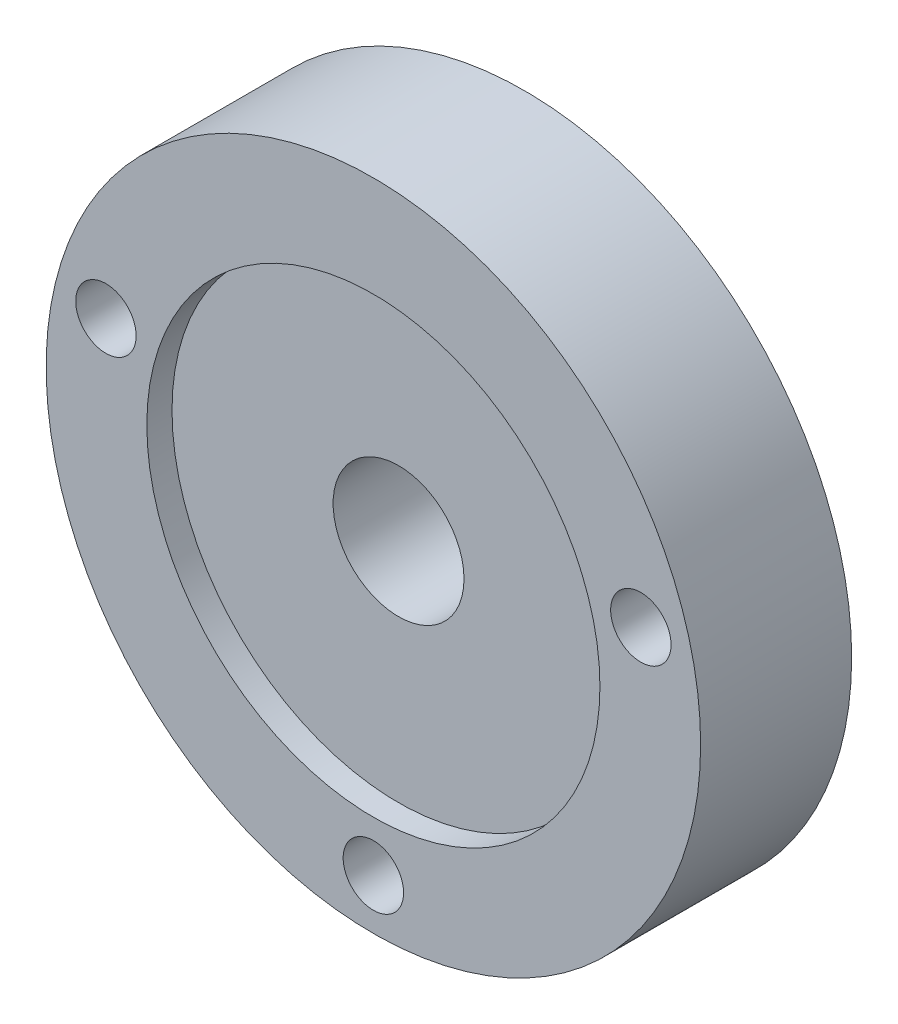
ISO-10303-21;
HEADER;
FILE_DESCRIPTION(('STEP AP214'),'2;1');
FILE_NAME('part.step','',(''),(''),'','','');
FILE_SCHEMA(('AUTOMOTIVE_DESIGN { 1 0 10303 214 1 1 1 1 }'));
ENDSEC;
DATA;
#1=APPLICATION_CONTEXT('core data for automotive mechanical design processes');
#2=APPLICATION_PROTOCOL_DEFINITION('international standard','automotive_design',2000,#1);
#3=PRODUCT_CONTEXT('',#1,'mechanical');
#4=PRODUCT('Part','Part','',(#3));
#5=PRODUCT_RELATED_PRODUCT_CATEGORY('part','',(#4));
#6=PRODUCT_DEFINITION_FORMATION('','',#4);
#7=PRODUCT_DEFINITION_CONTEXT('part definition',#1,'design');
#8=PRODUCT_DEFINITION('design','',#6,#7);
#9=PRODUCT_DEFINITION_SHAPE('','',#8);
#10=(LENGTH_UNIT() NAMED_UNIT(*) SI_UNIT(.MILLI.,.METRE.));
#11=(NAMED_UNIT(*) PLANE_ANGLE_UNIT() SI_UNIT($,.RADIAN.));
#12=(NAMED_UNIT(*) SI_UNIT($,.STERADIAN.) SOLID_ANGLE_UNIT());
#13=UNCERTAINTY_MEASURE_WITH_UNIT(LENGTH_MEASURE(1.E-05),#10,'distance_accuracy_value','');
#14=(GEOMETRIC_REPRESENTATION_CONTEXT(3) GLOBAL_UNCERTAINTY_ASSIGNED_CONTEXT((#13)) GLOBAL_UNIT_ASSIGNED_CONTEXT((#10,
#11,#12)) REPRESENTATION_CONTEXT('',''));
#15=CARTESIAN_POINT('',(0.,0.,0.));
#16=DIRECTION('',(0.,0.,1.));
#17=DIRECTION('',(1.,0.,0.));
#18=AXIS2_PLACEMENT_3D('',#15,#16,#17);
#19=CARTESIAN_POINT('',(0.,0.,15.));
#20=DIRECTION('',(0.,0.,-1.));
#21=DIRECTION('',(-1.,0.,0.));
#22=AXIS2_PLACEMENT_3D('',#19,#20,#21);
#23=CYLINDRICAL_SURFACE('',#22,32.5);
#24=CARTESIAN_POINT('',(0.,0.,15.));
#25=DIRECTION('',(0.,0.,1.));
#26=DIRECTION('',(1.,0.,0.));
#27=AXIS2_PLACEMENT_3D('',#24,#25,#26);
#28=CIRCLE('',#27,32.5);
#29=CARTESIAN_POINT('',(32.5,0.,15.));
#30=VERTEX_POINT('',#29);
#31=EDGE_CURVE('E11',#30,#30,#28,.T.);
#32=ORIENTED_EDGE('',*,*,#31,.F.);
#33=EDGE_LOOP('',(#32));
#34=FACE_BOUND('',#33,.T.);
#35=CARTESIAN_POINT('',(0.,0.,0.));
#36=DIRECTION('',(0.,0.,1.));
#37=DIRECTION('',(1.,0.,0.));
#38=AXIS2_PLACEMENT_3D('',#35,#36,#37);
#39=CIRCLE('',#38,32.5);
#40=CARTESIAN_POINT('',(32.5,0.,0.));
#41=VERTEX_POINT('',#40);
#42=EDGE_CURVE('E38',#41,#41,#39,.T.);
#43=ORIENTED_EDGE('',*,*,#42,.T.);
#44=EDGE_LOOP('',(#43));
#45=FACE_BOUND('',#44,.T.);
#46=ADVANCED_FACE('F35',(#34,#45),#23,.T.);
#47=CARTESIAN_POINT('',(0.,0.,15.));
#48=DIRECTION('',(0.,0.,1.));
#49=DIRECTION('',(1.,0.,0.));
#50=AXIS2_PLACEMENT_3D('',#47,#48,#49);
#51=PLANE('',#50);
#52=CARTESIAN_POINT('',(0.,-27.4999999999999,15.));
#53=DIRECTION('',(0.,0.,1.));
#54=DIRECTION('',(1.,0.,0.));
#55=AXIS2_PLACEMENT_3D('',#52,#53,#54);
#56=CIRCLE('',#55,2.99999999999999);
#57=CARTESIAN_POINT('',(2.99999999999998,-27.4999999999999,15.));
#58=VERTEX_POINT('',#57);
#59=EDGE_CURVE('E115',#58,#58,#56,.T.);
#60=ORIENTED_EDGE('',*,*,#59,.F.);
#61=EDGE_LOOP('',(#60));
#62=FACE_BOUND('',#61,.T.);
#63=CARTESIAN_POINT('',(-26.5629602229489,7.11752374031948,15.));
#64=DIRECTION('',(0.,0.,1.));
#65=DIRECTION('',(1.,0.,0.));
#66=AXIS2_PLACEMENT_3D('',#63,#64,#65);
#67=CIRCLE('',#66,2.99999999999999);
#68=CARTESIAN_POINT('',(-23.5629602229489,7.11752374031948,15.));
#69=VERTEX_POINT('',#68);
#70=EDGE_CURVE('E121',#69,#69,#67,.T.);
#71=ORIENTED_EDGE('',*,*,#70,.F.);
#72=EDGE_LOOP('',(#71));
#73=FACE_BOUND('',#72,.T.);
#74=CARTESIAN_POINT('',(26.5629602229493,7.11752374031948,15.));
#75=DIRECTION('',(0.,0.,1.));
#76=DIRECTION('',(1.,0.,0.));
#77=AXIS2_PLACEMENT_3D('',#74,#75,#76);
#78=CIRCLE('',#77,2.99999999999999);
#79=CARTESIAN_POINT('',(29.5629602229493,7.11752374031948,15.));
#80=VERTEX_POINT('',#79);
#81=EDGE_CURVE('E127',#80,#80,#78,.T.);
#82=ORIENTED_EDGE('',*,*,#81,.F.);
#83=EDGE_LOOP('',(#82));
#84=FACE_BOUND('',#83,.T.);
#85=CARTESIAN_POINT('',(0.,0.,15.));
#86=DIRECTION('',(0.,0.,1.));
#87=DIRECTION('',(1.,0.,0.));
#88=AXIS2_PLACEMENT_3D('',#85,#86,#87);
#89=CIRCLE('',#88,22.5);
#90=CARTESIAN_POINT('',(22.5,0.,15.));
#91=VERTEX_POINT('',#90);
#92=EDGE_CURVE('E137',#91,#91,#89,.T.);
#93=ORIENTED_EDGE('',*,*,#92,.F.);
#94=EDGE_LOOP('',(#93));
#95=FACE_BOUND('',#94,.T.);
#96=ORIENTED_EDGE('',*,*,#31,.T.);
#97=EDGE_LOOP('',(#96));
#98=FACE_BOUND('',#97,.T.);
#99=ADVANCED_FACE('F148',(#62,#73,#84,#95,#98),#51,.T.);
#100=CARTESIAN_POINT('',(0.,0.,0.));
#101=DIRECTION('',(0.,0.,1.));
#102=DIRECTION('',(1.,0.,0.));
#103=AXIS2_PLACEMENT_3D('',#100,#101,#102);
#104=PLANE('',#103);
#105=CARTESIAN_POINT('',(21.9238349295369,-9.70824317333135,0.));
#106=DIRECTION('',(0.,0.,-1.));
#107=DIRECTION('',(-1.,0.,0.));
#108=AXIS2_PLACEMENT_3D('',#105,#106,#107);
#109=CIRCLE('',#108,1.69999999999999);
#110=CARTESIAN_POINT('',(20.2238349295369,-9.70824317333135,0.));
#111=VERTEX_POINT('',#110);
#112=EDGE_CURVE('E75',#111,#111,#109,.T.);
#113=ORIENTED_EDGE('',*,*,#112,.F.);
#114=EDGE_LOOP('',(#113));
#115=FACE_BOUND('',#114,.T.);
#116=CARTESIAN_POINT('',(22.298556592593,9.38808065287239,0.));
#117=DIRECTION('',(0.,0.,-1.));
#118=DIRECTION('',(-1.,0.,0.));
#119=AXIS2_PLACEMENT_3D('',#116,#117,#118);
#120=CIRCLE('',#119,1.69999999999999);
#121=CARTESIAN_POINT('',(20.598556592593,9.38808065287239,0.));
#122=VERTEX_POINT('',#121);
#123=EDGE_CURVE('E74',#122,#122,#120,.T.);
#124=ORIENTED_EDGE('',*,*,#123,.F.);
#125=EDGE_LOOP('',(#124));
#126=FACE_BOUND('',#125,.T.);
#127=CARTESIAN_POINT('',(-22.2985565931064,-9.3880806527796,0.));
#128=DIRECTION('',(0.,0.,-1.));
#129=DIRECTION('',(-1.,0.,0.));
#130=AXIS2_PLACEMENT_3D('',#127,#128,#129);
#131=CIRCLE('',#130,1.7);
#132=CARTESIAN_POINT('',(-23.9985565931064,-9.3880806527796,0.));
#133=VERTEX_POINT('',#132);
#134=EDGE_CURVE('E85',#133,#133,#131,.T.);
#135=ORIENTED_EDGE('',*,*,#134,.F.);
#136=EDGE_LOOP('',(#135));
#137=FACE_BOUND('',#136,.T.);
#138=CARTESIAN_POINT('',(-21.9061778883355,10.6080699505751,0.));
#139=DIRECTION('',(0.,0.,-1.));
#140=DIRECTION('',(-1.,0.,0.));
#141=AXIS2_PLACEMENT_3D('',#138,#139,#140);
#142=CIRCLE('',#141,1.7);
#143=CARTESIAN_POINT('',(-23.6061778883355,10.6080699505751,0.));
#144=VERTEX_POINT('',#143);
#145=EDGE_CURVE('E91',#144,#144,#142,.T.);
#146=ORIENTED_EDGE('',*,*,#145,.F.);
#147=EDGE_LOOP('',(#146));
#148=FACE_BOUND('',#147,.T.);
#149=CARTESIAN_POINT('',(11.303753991217,11.2410310347164,0.));
#150=DIRECTION('',(0.,0.,-1.));
#151=DIRECTION('',(-1.,0.,0.));
#152=AXIS2_PLACEMENT_3D('',#149,#150,#151);
#153=CIRCLE('',#152,3.29999999999999);
#154=CARTESIAN_POINT('',(8.00375399121696,11.2410310347164,0.));
#155=VERTEX_POINT('',#154);
#156=EDGE_CURVE('E97',#155,#155,#153,.T.);
#157=ORIENTED_EDGE('',*,*,#156,.F.);
#158=EDGE_LOOP('',(#157));
#159=FACE_BOUND('',#158,.T.);
#160=CARTESIAN_POINT('',(-9.10737823347087,13.08400912297,0.));
#161=DIRECTION('',(0.,0.,-1.));
#162=DIRECTION('',(-1.,0.,0.));
#163=AXIS2_PLACEMENT_3D('',#160,#161,#162);
#164=CIRCLE('',#163,3.29999999999999);
#165=CARTESIAN_POINT('',(-12.4073782334709,13.08400912297,0.));
#166=VERTEX_POINT('',#165);
#167=EDGE_CURVE('E103',#166,#166,#164,.T.);
#168=ORIENTED_EDGE('',*,*,#167,.F.);
#169=EDGE_LOOP('',(#168));
#170=FACE_BOUND('',#169,.T.);
#171=CARTESIAN_POINT('',(-14.4667132583504,-6.69700235315458,0.));
#172=DIRECTION('',(0.,0.,-1.));
#173=DIRECTION('',(-1.,0.,0.));
#174=AXIS2_PLACEMENT_3D('',#171,#172,#173);
#175=CIRCLE('',#174,3.29999999999999);
#176=CARTESIAN_POINT('',(-17.7667132583504,-6.69700235315458,0.));
#177=VERTEX_POINT('',#176);
#178=EDGE_CURVE('E109',#177,#177,#175,.T.);
#179=ORIENTED_EDGE('',*,*,#178,.F.);
#180=EDGE_LOOP('',(#179));
#181=FACE_BOUND('',#180,.T.);
#182=CARTESIAN_POINT('',(0.,-27.4999999999999,0.));
#183=DIRECTION('',(0.,0.,1.));
#184=DIRECTION('',(1.,0.,0.));
#185=AXIS2_PLACEMENT_3D('',#182,#183,#184);
#186=CIRCLE('',#185,3.);
#187=CARTESIAN_POINT('',(2.99999999999998,-27.4999999999999,0.));
#188=VERTEX_POINT('',#187);
#189=EDGE_CURVE('E118',#188,#188,#186,.T.);
#190=ORIENTED_EDGE('',*,*,#189,.T.);
#191=EDGE_LOOP('',(#190));
#192=FACE_BOUND('',#191,.T.);
#193=CARTESIAN_POINT('',(-26.5629602229489,7.11752374031948,0.));
#194=DIRECTION('',(0.,0.,1.));
#195=DIRECTION('',(1.,0.,0.));
#196=AXIS2_PLACEMENT_3D('',#193,#194,#195);
#197=CIRCLE('',#196,3.);
#198=CARTESIAN_POINT('',(-23.5629602229489,7.11752374031948,0.));
#199=VERTEX_POINT('',#198);
#200=EDGE_CURVE('E124',#199,#199,#197,.T.);
#201=ORIENTED_EDGE('',*,*,#200,.T.);
#202=EDGE_LOOP('',(#201));
#203=FACE_BOUND('',#202,.T.);
#204=CARTESIAN_POINT('',(26.5629602229493,7.11752374031948,0.));
#205=DIRECTION('',(0.,0.,1.));
#206=DIRECTION('',(1.,0.,0.));
#207=AXIS2_PLACEMENT_3D('',#204,#205,#206);
#208=CIRCLE('',#207,3.);
#209=CARTESIAN_POINT('',(29.5629602229493,7.11752374031948,0.));
#210=VERTEX_POINT('',#209);
#211=EDGE_CURVE('E130',#210,#210,#208,.T.);
#212=ORIENTED_EDGE('',*,*,#211,.T.);
#213=EDGE_LOOP('',(#212));
#214=FACE_BOUND('',#213,.T.);
#215=CARTESIAN_POINT('',(0.,0.,0.));
#216=DIRECTION('',(0.,0.,1.));
#217=DIRECTION('',(1.,0.,0.));
#218=AXIS2_PLACEMENT_3D('',#215,#216,#217);
#219=CIRCLE('',#218,6.5);
#220=CARTESIAN_POINT('',(6.5,0.,0.));
#221=VERTEX_POINT('',#220);
#222=EDGE_CURVE('E134',#221,#221,#219,.T.);
#223=ORIENTED_EDGE('',*,*,#222,.T.);
#224=EDGE_LOOP('',(#223));
#225=FACE_BOUND('',#224,.T.);
#226=ORIENTED_EDGE('',*,*,#42,.F.);
#227=EDGE_LOOP('',(#226));
#228=FACE_BOUND('',#227,.T.);
#229=ADVANCED_FACE('F151',(#115,#126,#137,#148,#159,#170,#181,#192,#203,#214,#225,#228),#104,.F.);
#230=CARTESIAN_POINT('',(0.,0.,12.5));
#231=DIRECTION('',(0.,0.,1.));
#232=DIRECTION('',(1.,0.,0.));
#233=AXIS2_PLACEMENT_3D('',#230,#231,#232);
#234=CYLINDRICAL_SURFACE('',#233,22.5);
#235=CARTESIAN_POINT('',(0.,0.,12.5));
#236=DIRECTION('',(0.,0.,1.));
#237=DIRECTION('',(1.,0.,0.));
#238=AXIS2_PLACEMENT_3D('',#235,#236,#237);
#239=CIRCLE('',#238,22.5);
#240=CARTESIAN_POINT('',(22.5,0.,12.5));
#241=VERTEX_POINT('',#240);
#242=EDGE_CURVE('E140',#241,#241,#239,.T.);
#243=ORIENTED_EDGE('',*,*,#242,.F.);
#244=EDGE_LOOP('',(#243));
#245=FACE_BOUND('',#244,.T.);
#246=ORIENTED_EDGE('',*,*,#92,.T.);
#247=EDGE_LOOP('',(#246));
#248=FACE_BOUND('',#247,.T.);
#249=ADVANCED_FACE('F146',(#245,#248),#234,.F.);
#250=CARTESIAN_POINT('',(0.,0.,12.5));
#251=DIRECTION('',(0.,0.,1.));
#252=DIRECTION('',(1.,0.,0.));
#253=AXIS2_PLACEMENT_3D('',#250,#251,#252);
#254=PLANE('',#253);
#255=CARTESIAN_POINT('',(0.,0.,12.5));
#256=DIRECTION('',(0.,0.,1.));
#257=DIRECTION('',(1.,0.,0.));
#258=AXIS2_PLACEMENT_3D('',#255,#256,#257);
#259=CIRCLE('',#258,6.5);
#260=CARTESIAN_POINT('',(6.5,0.,12.5));
#261=VERTEX_POINT('',#260);
#262=EDGE_CURVE('E133',#261,#261,#259,.T.);
#263=ORIENTED_EDGE('',*,*,#262,.F.);
#264=EDGE_LOOP('',(#263));
#265=FACE_BOUND('',#264,.T.);
#266=ORIENTED_EDGE('',*,*,#242,.T.);
#267=EDGE_LOOP('',(#266));
#268=FACE_BOUND('',#267,.T.);
#269=ADVANCED_FACE('F168',(#265,#268),#254,.T.);
#270=CARTESIAN_POINT('',(0.,0.,0.));
#271=DIRECTION('',(0.,0.,1.));
#272=DIRECTION('',(1.,0.,0.));
#273=AXIS2_PLACEMENT_3D('',#270,#271,#272);
#274=CYLINDRICAL_SURFACE('',#273,6.5);
#275=CARTESIAN_POINT('',(6.5,0.,0.));
#276=CARTESIAN_POINT('',(6.5,0.,0.130208333333333));
#277=CARTESIAN_POINT('',(6.5,0.,0.260416666666667));
#278=CARTESIAN_POINT('',(6.5,0.,0.520833333333333));
#279=CARTESIAN_POINT('',(6.5,0.,0.651041666666667));
#280=CARTESIAN_POINT('',(6.5,0.,0.911458333333333));
#281=CARTESIAN_POINT('',(6.5,0.,1.04166666666667));
#282=CARTESIAN_POINT('',(6.5,0.,1.30208333333333));
#283=CARTESIAN_POINT('',(6.5,0.,1.43229166666667));
#284=CARTESIAN_POINT('',(6.5,0.,1.69270833333333));
#285=CARTESIAN_POINT('',(6.5,0.,1.82291666666667));
#286=CARTESIAN_POINT('',(6.5,0.,2.08333333333333));
#287=CARTESIAN_POINT('',(6.5,0.,2.21354166666667));
#288=CARTESIAN_POINT('',(6.5,0.,2.47395833333333));
#289=CARTESIAN_POINT('',(6.5,0.,2.60416666666667));
#290=CARTESIAN_POINT('',(6.5,0.,2.86458333333333));
#291=CARTESIAN_POINT('',(6.5,0.,2.99479166666667));
#292=CARTESIAN_POINT('',(6.5,0.,3.25520833333333));
#293=CARTESIAN_POINT('',(6.5,0.,3.38541666666667));
#294=CARTESIAN_POINT('',(6.5,0.,3.64583333333333));
#295=CARTESIAN_POINT('',(6.5,0.,3.77604166666667));
#296=CARTESIAN_POINT('',(6.5,0.,4.03645833333333));
#297=CARTESIAN_POINT('',(6.5,0.,4.16666666666667));
#298=CARTESIAN_POINT('',(6.5,0.,4.42708333333333));
#299=CARTESIAN_POINT('',(6.5,0.,4.55729166666667));
#300=CARTESIAN_POINT('',(6.5,0.,4.81770833333333));
#301=CARTESIAN_POINT('',(6.5,0.,4.94791666666667));
#302=CARTESIAN_POINT('',(6.5,0.,5.20833333333333));
#303=CARTESIAN_POINT('',(6.5,0.,5.33854166666667));
#304=CARTESIAN_POINT('',(6.5,0.,5.59895833333333));
#305=CARTESIAN_POINT('',(6.5,0.,5.72916666666667));
#306=CARTESIAN_POINT('',(6.5,0.,5.98958333333333));
#307=CARTESIAN_POINT('',(6.5,0.,6.11979166666667));
#308=CARTESIAN_POINT('',(6.5,0.,6.38020833333333));
#309=CARTESIAN_POINT('',(6.5,0.,6.51041666666667));
#310=CARTESIAN_POINT('',(6.5,0.,6.77083333333333));
#311=CARTESIAN_POINT('',(6.5,0.,6.90104166666667));
#312=CARTESIAN_POINT('',(6.5,0.,7.16145833333333));
#313=CARTESIAN_POINT('',(6.5,0.,7.29166666666667));
#314=CARTESIAN_POINT('',(6.5,0.,7.55208333333333));
#315=CARTESIAN_POINT('',(6.5,0.,7.68229166666667));
#316=CARTESIAN_POINT('',(6.5,0.,7.94270833333333));
#317=CARTESIAN_POINT('',(6.5,0.,8.07291666666667));
#318=CARTESIAN_POINT('',(6.5,0.,8.33333333333333));
#319=CARTESIAN_POINT('',(6.5,0.,8.46354166666667));
#320=CARTESIAN_POINT('',(6.5,0.,8.72395833333333));
#321=CARTESIAN_POINT('',(6.5,0.,8.85416666666667));
#322=CARTESIAN_POINT('',(6.5,0.,9.11458333333333));
#323=CARTESIAN_POINT('',(6.5,0.,9.24479166666667));
#324=CARTESIAN_POINT('',(6.5,0.,9.50520833333333));
#325=CARTESIAN_POINT('',(6.5,0.,9.63541666666667));
#326=CARTESIAN_POINT('',(6.5,0.,9.89583333333333));
#327=CARTESIAN_POINT('',(6.5,0.,10.0260416666667));
#328=CARTESIAN_POINT('',(6.5,0.,10.2864583333333));
#329=CARTESIAN_POINT('',(6.5,0.,10.4166666666667));
#330=CARTESIAN_POINT('',(6.5,0.,10.6770833333333));
#331=CARTESIAN_POINT('',(6.5,0.,10.8072916666667));
#332=CARTESIAN_POINT('',(6.5,0.,11.0677083333333));
#333=CARTESIAN_POINT('',(6.5,0.,11.1979166666667));
#334=CARTESIAN_POINT('',(6.5,0.,11.4583333333333));
#335=CARTESIAN_POINT('',(6.5,0.,11.5885416666667));
#336=CARTESIAN_POINT('',(6.5,0.,11.8489583333333));
#337=CARTESIAN_POINT('',(6.5,0.,11.9791666666667));
#338=CARTESIAN_POINT('',(6.5,0.,12.2395833333333));
#339=CARTESIAN_POINT('',(6.5,0.,12.3697916666667));
#340=CARTESIAN_POINT('',(6.5,0.,12.5));
#341=B_SPLINE_CURVE_WITH_KNOTS('',3,(#275,#276,#277,#278,#279,#280,#281,#282,#283,#284,#285,
#286,#287,#288,#289,#290,#291,#292,#293,#294,#295,#296,#297,#298,#299,#300,#301,#302,#303,#304,
#305,#306,#307,#308,#309,#310,#311,#312,#313,#314,#315,#316,#317,#318,#319,#320,#321,#322,#323,
#324,#325,#326,#327,#328,#329,#330,#331,#332,#333,#334,#335,#336,#337,#338,#339,#340),
.UNSPECIFIED.,.F.,.F.,(4,2,2,2,2,2,2,2,2,2,2,2,2,2,2,2,2,2,2,2,2,2,2,2,2,2,2,2,2,2,2,2,4),(0.,
0.390625,0.78125,1.171875,1.5625,1.953125,2.34375,2.734375,3.125,3.515625,3.90625,4.296875,
4.6875,5.078125,5.46875,5.859375,6.25,6.640625,7.03125,7.421875,7.8125,8.203125,8.59375,
8.984375,9.375,9.765625,10.15625,10.546875,10.9375,11.328125,11.71875,12.109375,12.5),.UNSPECIFIED.);
#342=EDGE_CURVE('BSEAM176',#221,#261,#341,.T.);
#343=ORIENTED_EDGE('',*,*,#222,.F.);
#344=ORIENTED_EDGE('',*,*,#262,.T.);
#345=ORIENTED_EDGE('',*,*,#342,.T.);
#346=ORIENTED_EDGE('',*,*,#342,.F.);
#347=EDGE_LOOP('',(#343,#345,#344,#346));
#348=FACE_BOUND('',#347,.T.);
#349=ADVANCED_FACE('F176',(#348),#274,.F.);
#350=CARTESIAN_POINT('',(26.5629602229493,7.11752374031948,15.));
#351=DIRECTION('',(0.,0.,1.));
#352=DIRECTION('',(1.,0.,0.));
#353=AXIS2_PLACEMENT_3D('',#350,#351,#352);
#354=CYLINDRICAL_SURFACE('',#353,2.99999999999999);
#355=ORIENTED_EDGE('',*,*,#211,.F.);
#356=EDGE_LOOP('',(#355));
#357=FACE_BOUND('',#356,.T.);
#358=ORIENTED_EDGE('',*,*,#81,.T.);
#359=EDGE_LOOP('',(#358));
#360=FACE_BOUND('',#359,.T.);
#361=ADVANCED_FACE('F180',(#357,#360),#354,.F.);
#362=CARTESIAN_POINT('',(-26.5629602229489,7.11752374031948,15.));
#363=DIRECTION('',(0.,0.,1.));
#364=DIRECTION('',(1.,0.,0.));
#365=AXIS2_PLACEMENT_3D('',#362,#363,#364);
#366=CYLINDRICAL_SURFACE('',#365,2.99999999999999);
#367=ORIENTED_EDGE('',*,*,#200,.F.);
#368=EDGE_LOOP('',(#367));
#369=FACE_BOUND('',#368,.T.);
#370=ORIENTED_EDGE('',*,*,#70,.T.);
#371=EDGE_LOOP('',(#370));
#372=FACE_BOUND('',#371,.T.);
#373=ADVANCED_FACE('F184',(#369,#372),#366,.F.);
#374=CARTESIAN_POINT('',(0.,-27.4999999999999,15.));
#375=DIRECTION('',(0.,0.,1.));
#376=DIRECTION('',(1.,0.,0.));
#377=AXIS2_PLACEMENT_3D('',#374,#375,#376);
#378=CYLINDRICAL_SURFACE('',#377,2.99999999999999);
#379=ORIENTED_EDGE('',*,*,#189,.F.);
#380=EDGE_LOOP('',(#379));
#381=FACE_BOUND('',#380,.T.);
#382=ORIENTED_EDGE('',*,*,#59,.T.);
#383=EDGE_LOOP('',(#382));
#384=FACE_BOUND('',#383,.T.);
#385=ADVANCED_FACE('F188',(#381,#384),#378,.F.);
#386=CARTESIAN_POINT('',(-14.4667132583504,-6.69700235315458,5.));
#387=DIRECTION('',(0.,0.,-1.));
#388=DIRECTION('',(-1.,0.,0.));
#389=AXIS2_PLACEMENT_3D('',#386,#387,#388);
#390=CONICAL_SURFACE('',#389,3.29999999999999,1.0471975511966);
#391=CARTESIAN_POINT('',(-14.4667132583504,-6.69700235315458,6.90525588832577));
#392=VERTEX_POINT('',#391);
#393=VERTEX_LOOP('',#392);
#394=FACE_BOUND('',#393,.T.);
#395=CARTESIAN_POINT('',(-14.4667132583504,-6.69700235315458,5.));
#396=DIRECTION('',(0.,0.,-1.));
#397=DIRECTION('',(-1.,0.,0.));
#398=AXIS2_PLACEMENT_3D('',#395,#396,#397);
#399=CIRCLE('',#398,3.29999999999999);
#400=CARTESIAN_POINT('',(-17.7667132583504,-6.69700235315458,5.));
#401=VERTEX_POINT('',#400);
#402=EDGE_CURVE('E112',#401,#401,#399,.T.);
#403=ORIENTED_EDGE('',*,*,#402,.T.);
#404=EDGE_LOOP('',(#403));
#405=FACE_BOUND('',#404,.T.);
#406=ADVANCED_FACE('F192',(#394,#405),#390,.F.);
#407=CARTESIAN_POINT('',(-14.4667132583504,-6.69700235315458,0.));
#408=DIRECTION('',(0.,0.,-1.));
#409=DIRECTION('',(-1.,0.,0.));
#410=AXIS2_PLACEMENT_3D('',#407,#408,#409);
#411=CYLINDRICAL_SURFACE('',#410,3.29999999999999);
#412=ORIENTED_EDGE('',*,*,#402,.F.);
#413=EDGE_LOOP('',(#412));
#414=FACE_BOUND('',#413,.T.);
#415=ORIENTED_EDGE('',*,*,#178,.T.);
#416=EDGE_LOOP('',(#415));
#417=FACE_BOUND('',#416,.T.);
#418=ADVANCED_FACE('F196',(#414,#417),#411,.F.);
#419=CARTESIAN_POINT('',(-9.10737823347087,13.08400912297,5.));
#420=DIRECTION('',(0.,0.,-1.));
#421=DIRECTION('',(-1.,0.,0.));
#422=AXIS2_PLACEMENT_3D('',#419,#420,#421);
#423=CONICAL_SURFACE('',#422,3.29999999999999,1.0471975511966);
#424=CARTESIAN_POINT('',(-9.10737823347087,13.08400912297,6.90525588832577));
#425=VERTEX_POINT('',#424);
#426=VERTEX_LOOP('',#425);
#427=FACE_BOUND('',#426,.T.);
#428=CARTESIAN_POINT('',(-9.10737823347087,13.08400912297,5.));
#429=DIRECTION('',(0.,0.,-1.));
#430=DIRECTION('',(-1.,0.,0.));
#431=AXIS2_PLACEMENT_3D('',#428,#429,#430);
#432=CIRCLE('',#431,3.29999999999999);
#433=CARTESIAN_POINT('',(-12.4073782334709,13.08400912297,5.));
#434=VERTEX_POINT('',#433);
#435=EDGE_CURVE('E106',#434,#434,#432,.T.);
#436=ORIENTED_EDGE('',*,*,#435,.T.);
#437=EDGE_LOOP('',(#436));
#438=FACE_BOUND('',#437,.T.);
#439=ADVANCED_FACE('F199',(#427,#438),#423,.F.);
#440=CARTESIAN_POINT('',(-9.10737823347087,13.08400912297,0.));
#441=DIRECTION('',(0.,0.,-1.));
#442=DIRECTION('',(-1.,0.,0.));
#443=AXIS2_PLACEMENT_3D('',#440,#441,#442);
#444=CYLINDRICAL_SURFACE('',#443,3.29999999999999);
#445=ORIENTED_EDGE('',*,*,#435,.F.);
#446=EDGE_LOOP('',(#445));
#447=FACE_BOUND('',#446,.T.);
#448=ORIENTED_EDGE('',*,*,#167,.T.);
#449=EDGE_LOOP('',(#448));
#450=FACE_BOUND('',#449,.T.);
#451=ADVANCED_FACE('F203',(#447,#450),#444,.F.);
#452=CARTESIAN_POINT('',(11.303753991217,11.2410310347164,5.));
#453=DIRECTION('',(0.,0.,-1.));
#454=DIRECTION('',(-1.,0.,0.));
#455=AXIS2_PLACEMENT_3D('',#452,#453,#454);
#456=CONICAL_SURFACE('',#455,3.29999999999999,1.0471975511966);
#457=CARTESIAN_POINT('',(11.303753991217,11.2410310347164,6.90525588832577));
#458=VERTEX_POINT('',#457);
#459=VERTEX_LOOP('',#458);
#460=FACE_BOUND('',#459,.T.);
#461=CARTESIAN_POINT('',(11.303753991217,11.2410310347164,5.));
#462=DIRECTION('',(0.,0.,-1.));
#463=DIRECTION('',(-1.,0.,0.));
#464=AXIS2_PLACEMENT_3D('',#461,#462,#463);
#465=CIRCLE('',#464,3.29999999999999);
#466=CARTESIAN_POINT('',(8.00375399121696,11.2410310347164,5.));
#467=VERTEX_POINT('',#466);
#468=EDGE_CURVE('E100',#467,#467,#465,.T.);
#469=ORIENTED_EDGE('',*,*,#468,.T.);
#470=EDGE_LOOP('',(#469));
#471=FACE_BOUND('',#470,.T.);
#472=ADVANCED_FACE('F206',(#460,#471),#456,.F.);
#473=CARTESIAN_POINT('',(11.303753991217,11.2410310347164,0.));
#474=DIRECTION('',(0.,0.,-1.));
#475=DIRECTION('',(-1.,0.,0.));
#476=AXIS2_PLACEMENT_3D('',#473,#474,#475);
#477=CYLINDRICAL_SURFACE('',#476,3.29999999999999);
#478=ORIENTED_EDGE('',*,*,#468,.F.);
#479=EDGE_LOOP('',(#478));
#480=FACE_BOUND('',#479,.T.);
#481=ORIENTED_EDGE('',*,*,#156,.T.);
#482=EDGE_LOOP('',(#481));
#483=FACE_BOUND('',#482,.T.);
#484=ADVANCED_FACE('F210',(#480,#483),#477,.F.);
#485=CARTESIAN_POINT('',(-21.9061778883355,10.6080699505751,5.));
#486=DIRECTION('',(0.,0.,-1.));
#487=DIRECTION('',(-1.,0.,0.));
#488=AXIS2_PLACEMENT_3D('',#485,#486,#487);
#489=CONICAL_SURFACE('',#488,1.7,1.0471975511966);
#490=CARTESIAN_POINT('',(-21.9061778883355,10.6080699505751,5.98149545762237));
#491=VERTEX_POINT('',#490);
#492=VERTEX_LOOP('',#491);
#493=FACE_BOUND('',#492,.T.);
#494=CARTESIAN_POINT('',(-21.9061778883355,10.6080699505751,5.));
#495=DIRECTION('',(0.,0.,-1.));
#496=DIRECTION('',(-1.,0.,0.));
#497=AXIS2_PLACEMENT_3D('',#494,#495,#496);
#498=CIRCLE('',#497,1.7);
#499=CARTESIAN_POINT('',(-23.6061778883355,10.6080699505751,5.));
#500=VERTEX_POINT('',#499);
#501=EDGE_CURVE('E94',#500,#500,#498,.T.);
#502=ORIENTED_EDGE('',*,*,#501,.T.);
#503=EDGE_LOOP('',(#502));
#504=FACE_BOUND('',#503,.T.);
#505=ADVANCED_FACE('F214',(#493,#504),#489,.F.);
#506=CARTESIAN_POINT('',(-21.9061778883355,10.6080699505751,0.));
#507=DIRECTION('',(0.,0.,-1.));
#508=DIRECTION('',(-1.,0.,0.));
#509=AXIS2_PLACEMENT_3D('',#506,#507,#508);
#510=CYLINDRICAL_SURFACE('',#509,1.7);
#511=ORIENTED_EDGE('',*,*,#501,.F.);
#512=EDGE_LOOP('',(#511));
#513=FACE_BOUND('',#512,.T.);
#514=ORIENTED_EDGE('',*,*,#145,.T.);
#515=EDGE_LOOP('',(#514));
#516=FACE_BOUND('',#515,.T.);
#517=ADVANCED_FACE('F218',(#513,#516),#510,.F.);
#518=CARTESIAN_POINT('',(-22.2985565931064,-9.3880806527796,5.));
#519=DIRECTION('',(0.,0.,-1.));
#520=DIRECTION('',(-1.,0.,0.));
#521=AXIS2_PLACEMENT_3D('',#518,#519,#520);
#522=CONICAL_SURFACE('',#521,1.7,1.0471975511966);
#523=CARTESIAN_POINT('',(-22.2985565931064,-9.3880806527796,5.98149545762237));
#524=VERTEX_POINT('',#523);
#525=VERTEX_LOOP('',#524);
#526=FACE_BOUND('',#525,.T.);
#527=CARTESIAN_POINT('',(-22.2985565931064,-9.3880806527796,5.));
#528=DIRECTION('',(0.,0.,-1.));
#529=DIRECTION('',(-1.,0.,0.));
#530=AXIS2_PLACEMENT_3D('',#527,#528,#529);
#531=CIRCLE('',#530,1.7);
#532=CARTESIAN_POINT('',(-23.9985565931064,-9.3880806527796,5.));
#533=VERTEX_POINT('',#532);
#534=EDGE_CURVE('E88',#533,#533,#531,.T.);
#535=ORIENTED_EDGE('',*,*,#534,.T.);
#536=EDGE_LOOP('',(#535));
#537=FACE_BOUND('',#536,.T.);
#538=ADVANCED_FACE('F222',(#526,#537),#522,.F.);
#539=CARTESIAN_POINT('',(-22.2985565931064,-9.3880806527796,0.));
#540=DIRECTION('',(0.,0.,-1.));
#541=DIRECTION('',(-1.,0.,0.));
#542=AXIS2_PLACEMENT_3D('',#539,#540,#541);
#543=CYLINDRICAL_SURFACE('',#542,1.7);
#544=ORIENTED_EDGE('',*,*,#534,.F.);
#545=EDGE_LOOP('',(#544));
#546=FACE_BOUND('',#545,.T.);
#547=ORIENTED_EDGE('',*,*,#134,.T.);
#548=EDGE_LOOP('',(#547));
#549=FACE_BOUND('',#548,.T.);
#550=ADVANCED_FACE('F226',(#546,#549),#543,.F.);
#551=CARTESIAN_POINT('',(22.298556592593,9.38808065287239,5.));
#552=DIRECTION('',(0.,0.,-1.));
#553=DIRECTION('',(-1.,0.,0.));
#554=AXIS2_PLACEMENT_3D('',#551,#552,#553);
#555=CONICAL_SURFACE('',#554,1.69999999999999,1.0471975511966);
#556=CARTESIAN_POINT('',(22.298556592593,9.38808065287239,5.98149545762237));
#557=VERTEX_POINT('',#556);
#558=VERTEX_LOOP('',#557);
#559=FACE_BOUND('',#558,.T.);
#560=CARTESIAN_POINT('',(22.298556592593,9.38808065287239,5.));
#561=DIRECTION('',(0.,0.,-1.));
#562=DIRECTION('',(-1.,0.,0.));
#563=AXIS2_PLACEMENT_3D('',#560,#561,#562);
#564=CIRCLE('',#563,1.69999999999999);
#565=CARTESIAN_POINT('',(20.598556592593,9.38808065287239,5.));
#566=VERTEX_POINT('',#565);
#567=EDGE_CURVE('E78',#566,#566,#564,.T.);
#568=ORIENTED_EDGE('',*,*,#567,.T.);
#569=EDGE_LOOP('',(#568));
#570=FACE_BOUND('',#569,.T.);
#571=ADVANCED_FACE('F230',(#559,#570),#555,.F.);
#572=CARTESIAN_POINT('',(22.298556592593,9.38808065287239,0.));
#573=DIRECTION('',(0.,0.,-1.));
#574=DIRECTION('',(-1.,0.,0.));
#575=AXIS2_PLACEMENT_3D('',#572,#573,#574);
#576=CYLINDRICAL_SURFACE('',#575,1.69999999999999);
#577=ORIENTED_EDGE('',*,*,#567,.F.);
#578=EDGE_LOOP('',(#577));
#579=FACE_BOUND('',#578,.T.);
#580=ORIENTED_EDGE('',*,*,#123,.T.);
#581=EDGE_LOOP('',(#580));
#582=FACE_BOUND('',#581,.T.);
#583=ADVANCED_FACE('F68',(#579,#582),#576,.F.);
#584=CARTESIAN_POINT('',(21.9238349295369,-9.70824317333135,5.));
#585=DIRECTION('',(0.,0.,-1.));
#586=DIRECTION('',(-1.,0.,0.));
#587=AXIS2_PLACEMENT_3D('',#584,#585,#586);
#588=CONICAL_SURFACE('',#587,1.69999999999999,1.0471975511966);
#589=CARTESIAN_POINT('',(21.9238349295369,-9.70824317333135,5.98149545762237));
#590=VERTEX_POINT('',#589);
#591=VERTEX_LOOP('',#590);
#592=FACE_BOUND('',#591,.T.);
#593=CARTESIAN_POINT('',(21.9238349295369,-9.70824317333135,5.));
#594=DIRECTION('',(0.,0.,-1.));
#595=DIRECTION('',(-1.,0.,0.));
#596=AXIS2_PLACEMENT_3D('',#593,#594,#595);
#597=CIRCLE('',#596,1.69999999999999);
#598=CARTESIAN_POINT('',(20.2238349295369,-9.70824317333135,5.));
#599=VERTEX_POINT('',#598);
#600=EDGE_CURVE('E72',#599,#599,#597,.T.);
#601=ORIENTED_EDGE('',*,*,#600,.T.);
#602=EDGE_LOOP('',(#601));
#603=FACE_BOUND('',#602,.T.);
#604=ADVANCED_FACE('F64',(#592,#603),#588,.F.);
#605=CARTESIAN_POINT('',(21.9238349295369,-9.70824317333135,0.));
#606=DIRECTION('',(0.,0.,-1.));
#607=DIRECTION('',(-1.,0.,0.));
#608=AXIS2_PLACEMENT_3D('',#605,#606,#607);
#609=CYLINDRICAL_SURFACE('',#608,1.69999999999999);
#610=ORIENTED_EDGE('',*,*,#600,.F.);
#611=EDGE_LOOP('',(#610));
#612=FACE_BOUND('',#611,.T.);
#613=ORIENTED_EDGE('',*,*,#112,.T.);
#614=EDGE_LOOP('',(#613));
#615=FACE_BOUND('',#614,.T.);
#616=ADVANCED_FACE('F67',(#612,#615),#609,.F.);
#617=CLOSED_SHELL('',(#46,#99,#229,#249,#269,#349,#361,#373,#385,#406,#418,#439,#451,#472,#484,
#505,#517,#538,#550,#571,#583,#604,#616));
#618=MANIFOLD_SOLID_BREP('B2',#617);
#619=ADVANCED_BREP_SHAPE_REPRESENTATION('',(#18,#618),#14);
#620=SHAPE_DEFINITION_REPRESENTATION(#9,#619);
ENDSEC;
END-ISO-10303-21;
